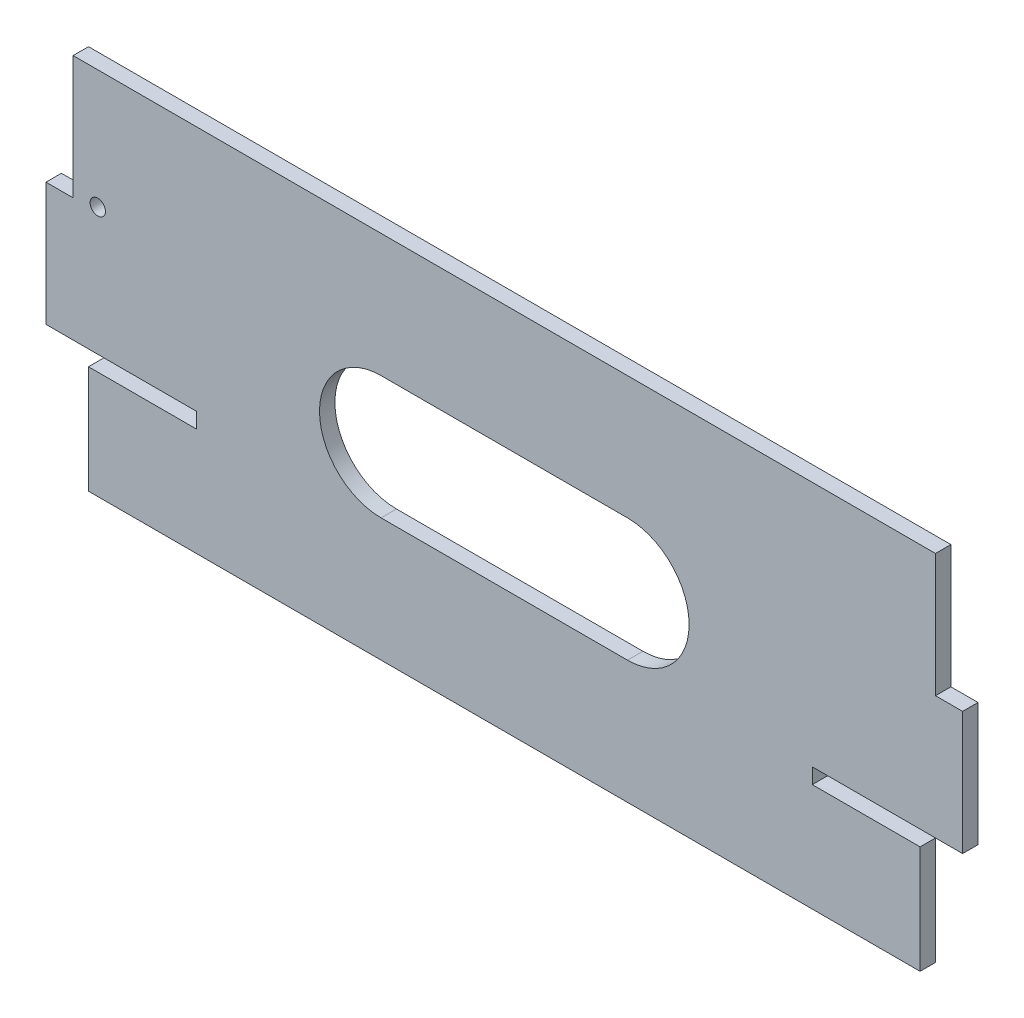
ISO-10303-21;
HEADER;
FILE_DESCRIPTION(('STEP AP214'),'2;1');
FILE_NAME('part.step','',(''),(''),'','','');
FILE_SCHEMA(('AUTOMOTIVE_DESIGN { 1 0 10303 214 1 1 1 1 }'));
ENDSEC;
DATA;
#1=APPLICATION_CONTEXT('core data for automotive mechanical design processes');
#2=APPLICATION_PROTOCOL_DEFINITION('international standard','automotive_design',2000,#1);
#3=PRODUCT_CONTEXT('',#1,'mechanical');
#4=PRODUCT('Part','Part','',(#3));
#5=PRODUCT_RELATED_PRODUCT_CATEGORY('part','',(#4));
#6=PRODUCT_DEFINITION_FORMATION('','',#4);
#7=PRODUCT_DEFINITION_CONTEXT('part definition',#1,'design');
#8=PRODUCT_DEFINITION('design','',#6,#7);
#9=PRODUCT_DEFINITION_SHAPE('','',#8);
#10=(LENGTH_UNIT() NAMED_UNIT(*) SI_UNIT(.MILLI.,.METRE.));
#11=(NAMED_UNIT(*) PLANE_ANGLE_UNIT() SI_UNIT($,.RADIAN.));
#12=(NAMED_UNIT(*) SI_UNIT($,.STERADIAN.) SOLID_ANGLE_UNIT());
#13=UNCERTAINTY_MEASURE_WITH_UNIT(LENGTH_MEASURE(1.E-05),#10,'distance_accuracy_value','');
#14=(GEOMETRIC_REPRESENTATION_CONTEXT(3) GLOBAL_UNCERTAINTY_ASSIGNED_CONTEXT((#13)) GLOBAL_UNIT_ASSIGNED_CONTEXT((#10,
#11,#12)) REPRESENTATION_CONTEXT('',''));
#15=CARTESIAN_POINT('',(0.,0.,0.));
#16=DIRECTION('',(0.,0.,1.));
#17=DIRECTION('',(1.,0.,0.));
#18=AXIS2_PLACEMENT_3D('',#15,#16,#17);
#19=CARTESIAN_POINT('',(0.,0.,-447.675));
#20=DIRECTION('',(0.,0.,1.));
#21=DIRECTION('',(1.,0.,0.));
#22=AXIS2_PLACEMENT_3D('',#19,#20,#21);
#23=PLANE('',#22);
#24=DIRECTION('',(-1.,0.,0.));
#25=VECTOR('',#24,1.);
#26=CARTESIAN_POINT('',(88.9,-60.325,-447.675));
#27=LINE('',#26,#25);
#28=CARTESIAN_POINT('',(88.9,-60.325,-447.675));
#29=VERTEX_POINT('',#28);
#30=CARTESIAN_POINT('',(-88.9,-60.3250000000001,-447.675));
#31=VERTEX_POINT('',#30);
#32=EDGE_CURVE('E211',#29,#31,#27,.T.);
#33=ORIENTED_EDGE('',*,*,#32,.T.);
#34=DIRECTION('',(0.,-1.,0.));
#35=VECTOR('',#34,1.);
#36=CARTESIAN_POINT('',(-88.9,-60.3250000000001,-447.675));
#37=LINE('',#36,#35);
#38=CARTESIAN_POINT('',(-88.9,-85.7250000000001,-447.675));
#39=VERTEX_POINT('',#38);
#40=EDGE_CURVE('E214',#31,#39,#37,.T.);
#41=ORIENTED_EDGE('',*,*,#40,.T.);
#42=DIRECTION('',(-1.,0.,0.));
#43=VECTOR('',#42,1.);
#44=CARTESIAN_POINT('',(-88.9,-85.7250000000001,-447.675));
#45=LINE('',#44,#43);
#46=CARTESIAN_POINT('',(-94.488,-85.7250000000001,-447.675));
#47=VERTEX_POINT('',#46);
#48=EDGE_CURVE('E217',#39,#47,#45,.T.);
#49=ORIENTED_EDGE('',*,*,#48,.T.);
#50=DIRECTION('',(0.,-1.,0.));
#51=VECTOR('',#50,1.);
#52=CARTESIAN_POINT('',(-94.488,-85.7250000000001,-447.675));
#53=LINE('',#52,#51);
#54=CARTESIAN_POINT('',(-94.488,-111.125,-447.675));
#55=VERTEX_POINT('',#54);
#56=EDGE_CURVE('E219',#47,#55,#53,.T.);
#57=ORIENTED_EDGE('',*,*,#56,.T.);
#58=DIRECTION('',(1.,0.,0.));
#59=VECTOR('',#58,1.);
#60=CARTESIAN_POINT('',(-94.488,-111.125,-447.675));
#61=LINE('',#60,#59);
#62=CARTESIAN_POINT('',(-63.5,-111.125,-447.675));
#63=VERTEX_POINT('',#62);
#64=EDGE_CURVE('E221',#55,#63,#61,.T.);
#65=ORIENTED_EDGE('',*,*,#64,.T.);
#66=DIRECTION('',(0.,-1.,0.));
#67=VECTOR('',#66,1.);
#68=CARTESIAN_POINT('',(-63.5,-111.125,-447.675));
#69=LINE('',#68,#67);
#70=CARTESIAN_POINT('',(-63.5,-114.3,-447.675));
#71=VERTEX_POINT('',#70);
#72=EDGE_CURVE('E223',#63,#71,#69,.T.);
#73=ORIENTED_EDGE('',*,*,#72,.T.);
#74=DIRECTION('',(-1.,0.,0.));
#75=VECTOR('',#74,1.);
#76=CARTESIAN_POINT('',(-63.5,-114.3,-447.675));
#77=LINE('',#76,#75);
#78=CARTESIAN_POINT('',(-85.725,-114.3,-447.675));
#79=VERTEX_POINT('',#78);
#80=EDGE_CURVE('E225',#71,#79,#77,.T.);
#81=ORIENTED_EDGE('',*,*,#80,.T.);
#82=DIRECTION('',(0.,-1.,0.));
#83=VECTOR('',#82,1.);
#84=CARTESIAN_POINT('',(-85.725,-114.3,-447.675));
#85=LINE('',#84,#83);
#86=CARTESIAN_POINT('',(-85.725,-136.525,-447.675));
#87=VERTEX_POINT('',#86);
#88=EDGE_CURVE('E227',#79,#87,#85,.T.);
#89=ORIENTED_EDGE('',*,*,#88,.T.);
#90=DIRECTION('',(1.,0.,0.));
#91=VECTOR('',#90,1.);
#92=CARTESIAN_POINT('',(-85.725,-136.525,-447.675));
#93=LINE('',#92,#91);
#94=CARTESIAN_POINT('',(85.725,-136.525,-447.675));
#95=VERTEX_POINT('',#94);
#96=EDGE_CURVE('E229',#87,#95,#93,.T.);
#97=ORIENTED_EDGE('',*,*,#96,.T.);
#98=DIRECTION('',(0.,1.,0.));
#99=VECTOR('',#98,1.);
#100=CARTESIAN_POINT('',(85.725,-114.3,-447.675));
#101=LINE('',#100,#99);
#102=CARTESIAN_POINT('',(85.725,-114.3,-447.675));
#103=VERTEX_POINT('',#102);
#104=EDGE_CURVE('E231',#95,#103,#101,.T.);
#105=ORIENTED_EDGE('',*,*,#104,.T.);
#106=DIRECTION('',(-1.,0.,0.));
#107=VECTOR('',#106,1.);
#108=CARTESIAN_POINT('',(63.5,-114.3,-447.675));
#109=LINE('',#108,#107);
#110=CARTESIAN_POINT('',(63.5,-114.3,-447.675));
#111=VERTEX_POINT('',#110);
#112=EDGE_CURVE('E233',#103,#111,#109,.T.);
#113=ORIENTED_EDGE('',*,*,#112,.T.);
#114=DIRECTION('',(0.,1.,0.));
#115=VECTOR('',#114,1.);
#116=CARTESIAN_POINT('',(63.5,-111.125,-447.675));
#117=LINE('',#116,#115);
#118=CARTESIAN_POINT('',(63.5,-111.125,-447.675));
#119=VERTEX_POINT('',#118);
#120=EDGE_CURVE('E235',#111,#119,#117,.T.);
#121=ORIENTED_EDGE('',*,*,#120,.T.);
#122=DIRECTION('',(1.,0.,0.));
#123=VECTOR('',#122,1.);
#124=CARTESIAN_POINT('',(88.9,-111.125,-447.675));
#125=LINE('',#124,#123);
#126=CARTESIAN_POINT('',(94.488,-111.125,-447.675));
#127=VERTEX_POINT('',#126);
#128=EDGE_CURVE('E237',#119,#127,#125,.T.);
#129=ORIENTED_EDGE('',*,*,#128,.T.);
#130=DIRECTION('',(0.,1.,0.));
#131=VECTOR('',#130,1.);
#132=CARTESIAN_POINT('',(94.488,-85.725,-447.675));
#133=LINE('',#132,#131);
#134=CARTESIAN_POINT('',(94.488,-85.725,-447.675));
#135=VERTEX_POINT('',#134);
#136=EDGE_CURVE('E239',#127,#135,#133,.T.);
#137=ORIENTED_EDGE('',*,*,#136,.T.);
#138=DIRECTION('',(-1.,0.,0.));
#139=VECTOR('',#138,1.);
#140=CARTESIAN_POINT('',(88.9,-85.725,-447.675));
#141=LINE('',#140,#139);
#142=CARTESIAN_POINT('',(88.9,-85.725,-447.675));
#143=VERTEX_POINT('',#142);
#144=EDGE_CURVE('E241',#135,#143,#141,.T.);
#145=ORIENTED_EDGE('',*,*,#144,.T.);
#146=DIRECTION('',(0.,1.,0.));
#147=VECTOR('',#146,1.);
#148=CARTESIAN_POINT('',(88.9,-60.325,-447.675));
#149=LINE('',#148,#147);
#150=EDGE_CURVE('E243',#143,#29,#149,.T.);
#151=ORIENTED_EDGE('',*,*,#150,.T.);
#152=EDGE_LOOP('',(#33,#41,#49,#57,#65,#73,#81,#89,#97,#105,#113,#121,#129,#137,#145,#151));
#153=FACE_BOUND('',#152,.T.);
#154=CARTESIAN_POINT('',(-83.82,-84.8367141014244,-447.675));
#155=DIRECTION('',(0.,0.,1.));
#156=DIRECTION('',(1.,0.,0.));
#157=AXIS2_PLACEMENT_3D('',#154,#155,#156);
#158=CIRCLE('',#157,1.58749999999999);
#159=CARTESIAN_POINT('',(-82.2325,-84.8367141014244,-447.675));
#160=VERTEX_POINT('',#159);
#161=EDGE_CURVE('E205',#160,#160,#158,.T.);
#162=ORIENTED_EDGE('',*,*,#161,.F.);
#163=EDGE_LOOP('',(#162));
#164=FACE_BOUND('',#163,.T.);
#165=DIRECTION('',(1.,0.,0.));
#166=VECTOR('',#165,1.);
#167=CARTESIAN_POINT('',(-25.4,-111.125,-447.675));
#168=LINE('',#167,#166);
#169=CARTESIAN_POINT('',(-25.4,-111.125,-447.675));
#170=VERTEX_POINT('',#169);
#171=CARTESIAN_POINT('',(25.4,-111.125,-447.675));
#172=VERTEX_POINT('',#171);
#173=EDGE_CURVE('E177',#170,#172,#168,.T.);
#174=ORIENTED_EDGE('',*,*,#173,.F.);
#175=CARTESIAN_POINT('',(-25.4,-98.4250000000001,-447.675));
#176=DIRECTION('',(0.,0.,1.));
#177=DIRECTION('',(1.,0.,0.));
#178=AXIS2_PLACEMENT_3D('',#175,#176,#177);
#179=CIRCLE('',#178,12.7);
#180=CARTESIAN_POINT('',(-25.4,-85.7250000000001,-447.675));
#181=VERTEX_POINT('',#180);
#182=EDGE_CURVE('E169',#181,#170,#179,.T.);
#183=ORIENTED_EDGE('',*,*,#182,.F.);
#184=DIRECTION('',(-1.,0.,0.));
#185=VECTOR('',#184,1.);
#186=CARTESIAN_POINT('',(-25.4,-85.7250000000001,-447.675));
#187=LINE('',#186,#185);
#188=CARTESIAN_POINT('',(25.4,-85.7250000000001,-447.675));
#189=VERTEX_POINT('',#188);
#190=EDGE_CURVE('E191',#189,#181,#187,.T.);
#191=ORIENTED_EDGE('',*,*,#190,.F.);
#192=CARTESIAN_POINT('',(25.4,-98.4250000000001,-447.675));
#193=DIRECTION('',(0.,0.,1.));
#194=DIRECTION('',(1.,0.,0.));
#195=AXIS2_PLACEMENT_3D('',#192,#193,#194);
#196=CIRCLE('',#195,12.7);
#197=EDGE_CURVE('E189',#172,#189,#196,.T.);
#198=ORIENTED_EDGE('',*,*,#197,.F.);
#199=EDGE_LOOP('',(#174,#183,#191,#198));
#200=FACE_BOUND('',#199,.T.);
#201=ADVANCED_FACE('F32',(#153,#164,#200),#23,.T.);
#202=CARTESIAN_POINT('',(0.,0.,-450.85));
#203=DIRECTION('',(0.,0.,1.));
#204=DIRECTION('',(1.,0.,0.));
#205=AXIS2_PLACEMENT_3D('',#202,#203,#204);
#206=PLANE('',#205);
#207=CARTESIAN_POINT('',(-83.82,-84.8367141014244,-450.85));
#208=DIRECTION('',(0.,0.,1.));
#209=DIRECTION('',(1.,0.,0.));
#210=AXIS2_PLACEMENT_3D('',#207,#208,#209);
#211=CIRCLE('',#210,1.58749999999999);
#212=CARTESIAN_POINT('',(-82.2325,-84.8367141014244,-450.85));
#213=VERTEX_POINT('',#212);
#214=EDGE_CURVE('E185',#213,#213,#211,.T.);
#215=ORIENTED_EDGE('',*,*,#214,.T.);
#216=EDGE_LOOP('',(#215));
#217=FACE_BOUND('',#216,.T.);
#218=DIRECTION('',(-1.,0.,0.));
#219=VECTOR('',#218,1.);
#220=CARTESIAN_POINT('',(88.9,-60.325,-450.85));
#221=LINE('',#220,#219);
#222=CARTESIAN_POINT('',(88.9,-60.325,-450.85));
#223=VERTEX_POINT('',#222);
#224=CARTESIAN_POINT('',(-88.9,-60.3250000000001,-450.85));
#225=VERTEX_POINT('',#224);
#226=EDGE_CURVE('E208',#223,#225,#221,.T.);
#227=ORIENTED_EDGE('',*,*,#226,.F.);
#228=DIRECTION('',(0.,1.,0.));
#229=VECTOR('',#228,1.);
#230=CARTESIAN_POINT('',(88.9,-60.325,-450.85));
#231=LINE('',#230,#229);
#232=CARTESIAN_POINT('',(88.9,-85.725,-450.85));
#233=VERTEX_POINT('',#232);
#234=EDGE_CURVE('E215',#233,#223,#231,.T.);
#235=ORIENTED_EDGE('',*,*,#234,.F.);
#236=DIRECTION('',(-1.,0.,0.));
#237=VECTOR('',#236,1.);
#238=CARTESIAN_POINT('',(88.9,-85.725,-450.85));
#239=LINE('',#238,#237);
#240=CARTESIAN_POINT('',(94.488,-85.725,-450.85));
#241=VERTEX_POINT('',#240);
#242=EDGE_CURVE('E276',#241,#233,#239,.T.);
#243=ORIENTED_EDGE('',*,*,#242,.F.);
#244=DIRECTION('',(0.,1.,0.));
#245=VECTOR('',#244,1.);
#246=CARTESIAN_POINT('',(94.488,-85.725,-450.85));
#247=LINE('',#246,#245);
#248=CARTESIAN_POINT('',(94.488,-111.125,-450.85));
#249=VERTEX_POINT('',#248);
#250=EDGE_CURVE('E274',#249,#241,#247,.T.);
#251=ORIENTED_EDGE('',*,*,#250,.F.);
#252=DIRECTION('',(1.,0.,0.));
#253=VECTOR('',#252,1.);
#254=CARTESIAN_POINT('',(94.488,-111.125,-450.85));
#255=LINE('',#254,#253);
#256=CARTESIAN_POINT('',(63.5,-111.125,-450.85));
#257=VERTEX_POINT('',#256);
#258=EDGE_CURVE('E272',#257,#249,#255,.T.);
#259=ORIENTED_EDGE('',*,*,#258,.F.);
#260=DIRECTION('',(0.,1.,0.));
#261=VECTOR('',#260,1.);
#262=CARTESIAN_POINT('',(63.5,-111.125,-450.85));
#263=LINE('',#262,#261);
#264=CARTESIAN_POINT('',(63.5,-114.3,-450.85));
#265=VERTEX_POINT('',#264);
#266=EDGE_CURVE('E269',#265,#257,#263,.T.);
#267=ORIENTED_EDGE('',*,*,#266,.F.);
#268=DIRECTION('',(-1.,0.,0.));
#269=VECTOR('',#268,1.);
#270=CARTESIAN_POINT('',(63.5,-114.3,-450.85));
#271=LINE('',#270,#269);
#272=CARTESIAN_POINT('',(85.725,-114.3,-450.85));
#273=VERTEX_POINT('',#272);
#274=EDGE_CURVE('E267',#273,#265,#271,.T.);
#275=ORIENTED_EDGE('',*,*,#274,.F.);
#276=DIRECTION('',(0.,1.,0.));
#277=VECTOR('',#276,1.);
#278=CARTESIAN_POINT('',(85.725,-114.3,-450.85));
#279=LINE('',#278,#277);
#280=CARTESIAN_POINT('',(85.725,-136.525,-450.85));
#281=VERTEX_POINT('',#280);
#282=EDGE_CURVE('E265',#281,#273,#279,.T.);
#283=ORIENTED_EDGE('',*,*,#282,.F.);
#284=DIRECTION('',(1.,0.,0.));
#285=VECTOR('',#284,1.);
#286=CARTESIAN_POINT('',(-85.725,-136.525,-450.85));
#287=LINE('',#286,#285);
#288=CARTESIAN_POINT('',(-85.725,-136.525,-450.85));
#289=VERTEX_POINT('',#288);
#290=EDGE_CURVE('E263',#289,#281,#287,.T.);
#291=ORIENTED_EDGE('',*,*,#290,.F.);
#292=DIRECTION('',(0.,-1.,0.));
#293=VECTOR('',#292,1.);
#294=CARTESIAN_POINT('',(-85.725,-114.3,-450.85));
#295=LINE('',#294,#293);
#296=CARTESIAN_POINT('',(-85.725,-114.3,-450.85));
#297=VERTEX_POINT('',#296);
#298=EDGE_CURVE('E261',#297,#289,#295,.T.);
#299=ORIENTED_EDGE('',*,*,#298,.F.);
#300=DIRECTION('',(-1.,0.,0.));
#301=VECTOR('',#300,1.);
#302=CARTESIAN_POINT('',(-63.5,-114.3,-450.85));
#303=LINE('',#302,#301);
#304=CARTESIAN_POINT('',(-63.5,-114.3,-450.85));
#305=VERTEX_POINT('',#304);
#306=EDGE_CURVE('E259',#305,#297,#303,.T.);
#307=ORIENTED_EDGE('',*,*,#306,.F.);
#308=DIRECTION('',(0.,-1.,0.));
#309=VECTOR('',#308,1.);
#310=CARTESIAN_POINT('',(-63.5,-111.125,-450.85));
#311=LINE('',#310,#309);
#312=CARTESIAN_POINT('',(-63.5,-111.125,-450.85));
#313=VERTEX_POINT('',#312);
#314=EDGE_CURVE('E257',#313,#305,#311,.T.);
#315=ORIENTED_EDGE('',*,*,#314,.F.);
#316=DIRECTION('',(1.,0.,0.));
#317=VECTOR('',#316,1.);
#318=CARTESIAN_POINT('',(-88.9,-111.125,-450.85));
#319=LINE('',#318,#317);
#320=CARTESIAN_POINT('',(-94.488,-111.125,-450.85));
#321=VERTEX_POINT('',#320);
#322=EDGE_CURVE('E255',#321,#313,#319,.T.);
#323=ORIENTED_EDGE('',*,*,#322,.F.);
#324=DIRECTION('',(0.,-1.,0.));
#325=VECTOR('',#324,1.);
#326=CARTESIAN_POINT('',(-94.488,-85.7250000000001,-450.85));
#327=LINE('',#326,#325);
#328=CARTESIAN_POINT('',(-94.488,-85.7250000000001,-450.85));
#329=VERTEX_POINT('',#328);
#330=EDGE_CURVE('E252',#329,#321,#327,.T.);
#331=ORIENTED_EDGE('',*,*,#330,.F.);
#332=DIRECTION('',(-1.,0.,0.));
#333=VECTOR('',#332,1.);
#334=CARTESIAN_POINT('',(-88.9,-85.7250000000001,-450.85));
#335=LINE('',#334,#333);
#336=CARTESIAN_POINT('',(-88.9,-85.7250000000001,-450.85));
#337=VERTEX_POINT('',#336);
#338=EDGE_CURVE('E250',#337,#329,#335,.T.);
#339=ORIENTED_EDGE('',*,*,#338,.F.);
#340=DIRECTION('',(0.,-1.,0.));
#341=VECTOR('',#340,1.);
#342=CARTESIAN_POINT('',(-88.9,-60.3250000000001,-450.85));
#343=LINE('',#342,#341);
#344=EDGE_CURVE('E248',#225,#337,#343,.T.);
#345=ORIENTED_EDGE('',*,*,#344,.F.);
#346=EDGE_LOOP('',(#227,#235,#243,#251,#259,#267,#275,#283,#291,#299,#307,#315,#323,#331,#339,#345));
#347=FACE_BOUND('',#346,.T.);
#348=CARTESIAN_POINT('',(-25.4,-98.4250000000001,-450.85));
#349=DIRECTION('',(0.,0.,1.));
#350=DIRECTION('',(1.,0.,0.));
#351=AXIS2_PLACEMENT_3D('',#348,#349,#350);
#352=CIRCLE('',#351,12.7);
#353=CARTESIAN_POINT('',(-25.4,-85.7250000000001,-450.85));
#354=VERTEX_POINT('',#353);
#355=CARTESIAN_POINT('',(-25.4,-111.125,-450.85));
#356=VERTEX_POINT('',#355);
#357=EDGE_CURVE('E55',#354,#356,#352,.T.);
#358=ORIENTED_EDGE('',*,*,#357,.T.);
#359=DIRECTION('',(1.,0.,0.));
#360=VECTOR('',#359,1.);
#361=CARTESIAN_POINT('',(-25.4,-111.125,-450.85));
#362=LINE('',#361,#360);
#363=CARTESIAN_POINT('',(25.4,-111.125,-450.85));
#364=VERTEX_POINT('',#363);
#365=EDGE_CURVE('E184',#356,#364,#362,.T.);
#366=ORIENTED_EDGE('',*,*,#365,.T.);
#367=CARTESIAN_POINT('',(25.4,-98.4250000000001,-450.85));
#368=DIRECTION('',(0.,0.,1.));
#369=DIRECTION('',(1.,0.,0.));
#370=AXIS2_PLACEMENT_3D('',#367,#368,#369);
#371=CIRCLE('',#370,12.7);
#372=CARTESIAN_POINT('',(25.4,-85.7250000000001,-450.85));
#373=VERTEX_POINT('',#372);
#374=EDGE_CURVE('E197',#364,#373,#371,.T.);
#375=ORIENTED_EDGE('',*,*,#374,.T.);
#376=DIRECTION('',(-1.,0.,0.));
#377=VECTOR('',#376,1.);
#378=CARTESIAN_POINT('',(-25.4,-85.7250000000001,-450.85));
#379=LINE('',#378,#377);
#380=EDGE_CURVE('E178',#373,#354,#379,.T.);
#381=ORIENTED_EDGE('',*,*,#380,.T.);
#382=EDGE_LOOP('',(#358,#366,#375,#381));
#383=FACE_BOUND('',#382,.T.);
#384=ADVANCED_FACE('F330',(#217,#347,#383),#206,.F.);
#385=CARTESIAN_POINT('',(88.9,-60.325,-447.675));
#386=DIRECTION('',(0.,-1.,0.));
#387=DIRECTION('',(1.,0.,0.));
#388=AXIS2_PLACEMENT_3D('',#385,#386,#387);
#389=PLANE('',#388);
#390=ORIENTED_EDGE('',*,*,#226,.T.);
#391=DIRECTION('',(0.,0.,-1.));
#392=VECTOR('',#391,1.);
#393=CARTESIAN_POINT('',(-88.9,-60.3250000000001,-447.675));
#394=LINE('',#393,#392);
#395=EDGE_CURVE('E11',#31,#225,#394,.T.);
#396=ORIENTED_EDGE('',*,*,#395,.F.);
#397=ORIENTED_EDGE('',*,*,#32,.F.);
#398=DIRECTION('',(0.,0.,-1.));
#399=VECTOR('',#398,1.);
#400=CARTESIAN_POINT('',(88.9,-60.325,-447.675));
#401=LINE('',#400,#399);
#402=EDGE_CURVE('E245',#29,#223,#401,.T.);
#403=ORIENTED_EDGE('',*,*,#402,.T.);
#404=EDGE_LOOP('',(#390,#396,#397,#403));
#405=FACE_BOUND('',#404,.T.);
#406=ADVANCED_FACE('F34',(#405),#389,.F.);
#407=CARTESIAN_POINT('',(-88.9,-60.3250000000001,-447.675));
#408=DIRECTION('',(1.,0.,0.));
#409=DIRECTION('',(0.,0.,-1.));
#410=AXIS2_PLACEMENT_3D('',#407,#408,#409);
#411=PLANE('',#410);
#412=ORIENTED_EDGE('',*,*,#344,.T.);
#413=DIRECTION('',(0.,0.,-1.));
#414=VECTOR('',#413,1.);
#415=CARTESIAN_POINT('',(-88.9,-85.7250000000001,-447.675));
#416=LINE('',#415,#414);
#417=EDGE_CURVE('E40',#39,#337,#416,.T.);
#418=ORIENTED_EDGE('',*,*,#417,.F.);
#419=ORIENTED_EDGE('',*,*,#40,.F.);
#420=ORIENTED_EDGE('',*,*,#395,.T.);
#421=EDGE_LOOP('',(#412,#418,#419,#420));
#422=FACE_BOUND('',#421,.T.);
#423=ADVANCED_FACE('F347',(#422),#411,.F.);
#424=CARTESIAN_POINT('',(-88.9,-85.7250000000001,-447.675));
#425=DIRECTION('',(0.,-1.,0.));
#426=DIRECTION('',(0.,0.,-1.));
#427=AXIS2_PLACEMENT_3D('',#424,#425,#426);
#428=PLANE('',#427);
#429=ORIENTED_EDGE('',*,*,#338,.T.);
#430=DIRECTION('',(0.,0.,-1.));
#431=VECTOR('',#430,1.);
#432=CARTESIAN_POINT('',(-94.488,-85.7250000000001,-447.675));
#433=LINE('',#432,#431);
#434=EDGE_CURVE('E317',#47,#329,#433,.T.);
#435=ORIENTED_EDGE('',*,*,#434,.F.);
#436=ORIENTED_EDGE('',*,*,#48,.F.);
#437=ORIENTED_EDGE('',*,*,#417,.T.);
#438=EDGE_LOOP('',(#429,#435,#436,#437));
#439=FACE_BOUND('',#438,.T.);
#440=ADVANCED_FACE('F324',(#439),#428,.F.);
#441=CARTESIAN_POINT('',(-94.488,-85.7250000000001,-447.675));
#442=DIRECTION('',(1.,0.,0.));
#443=DIRECTION('',(0.,0.,-1.));
#444=AXIS2_PLACEMENT_3D('',#441,#442,#443);
#445=PLANE('',#444);
#446=ORIENTED_EDGE('',*,*,#330,.T.);
#447=DIRECTION('',(0.,0.,-1.));
#448=VECTOR('',#447,1.);
#449=CARTESIAN_POINT('',(-94.488,-111.125,-447.675));
#450=LINE('',#449,#448);
#451=EDGE_CURVE('E314',#55,#321,#450,.T.);
#452=ORIENTED_EDGE('',*,*,#451,.F.);
#453=ORIENTED_EDGE('',*,*,#56,.F.);
#454=ORIENTED_EDGE('',*,*,#434,.T.);
#455=EDGE_LOOP('',(#446,#452,#453,#454));
#456=FACE_BOUND('',#455,.T.);
#457=ADVANCED_FACE('F335',(#456),#445,.F.);
#458=CARTESIAN_POINT('',(-88.9,-111.125,-447.675));
#459=DIRECTION('',(0.,1.,0.));
#460=DIRECTION('',(-1.,0.,0.));
#461=AXIS2_PLACEMENT_3D('',#458,#459,#460);
#462=PLANE('',#461);
#463=ORIENTED_EDGE('',*,*,#322,.T.);
#464=DIRECTION('',(0.,0.,-1.));
#465=VECTOR('',#464,1.);
#466=CARTESIAN_POINT('',(-63.5,-111.125,-447.675));
#467=LINE('',#466,#465);
#468=EDGE_CURVE('E311',#63,#313,#467,.T.);
#469=ORIENTED_EDGE('',*,*,#468,.F.);
#470=ORIENTED_EDGE('',*,*,#64,.F.);
#471=ORIENTED_EDGE('',*,*,#451,.T.);
#472=EDGE_LOOP('',(#463,#469,#470,#471));
#473=FACE_BOUND('',#472,.T.);
#474=ADVANCED_FACE('F339',(#473),#462,.F.);
#475=CARTESIAN_POINT('',(-63.5,-111.125,-447.675));
#476=DIRECTION('',(1.,0.,0.));
#477=DIRECTION('',(0.,1.,0.));
#478=AXIS2_PLACEMENT_3D('',#475,#476,#477);
#479=PLANE('',#478);
#480=ORIENTED_EDGE('',*,*,#314,.T.);
#481=DIRECTION('',(0.,0.,-1.));
#482=VECTOR('',#481,1.);
#483=CARTESIAN_POINT('',(-63.5,-114.3,-447.675));
#484=LINE('',#483,#482);
#485=EDGE_CURVE('E308',#71,#305,#484,.T.);
#486=ORIENTED_EDGE('',*,*,#485,.F.);
#487=ORIENTED_EDGE('',*,*,#72,.F.);
#488=ORIENTED_EDGE('',*,*,#468,.T.);
#489=EDGE_LOOP('',(#480,#486,#487,#488));
#490=FACE_BOUND('',#489,.T.);
#491=ADVANCED_FACE('F399',(#490),#479,.F.);
#492=CARTESIAN_POINT('',(-63.5,-114.3,-447.675));
#493=DIRECTION('',(0.,-1.,0.));
#494=DIRECTION('',(1.,0.,0.));
#495=AXIS2_PLACEMENT_3D('',#492,#493,#494);
#496=PLANE('',#495);
#497=ORIENTED_EDGE('',*,*,#306,.T.);
#498=DIRECTION('',(0.,0.,-1.));
#499=VECTOR('',#498,1.);
#500=CARTESIAN_POINT('',(-85.725,-114.3,-447.675));
#501=LINE('',#500,#499);
#502=EDGE_CURVE('E305',#79,#297,#501,.T.);
#503=ORIENTED_EDGE('',*,*,#502,.F.);
#504=ORIENTED_EDGE('',*,*,#80,.F.);
#505=ORIENTED_EDGE('',*,*,#485,.T.);
#506=EDGE_LOOP('',(#497,#503,#504,#505));
#507=FACE_BOUND('',#506,.T.);
#508=ADVANCED_FACE('F396',(#507),#496,.F.);
#509=CARTESIAN_POINT('',(-85.725,-114.3,-447.675));
#510=DIRECTION('',(1.,0.,0.));
#511=DIRECTION('',(0.,0.,-1.));
#512=AXIS2_PLACEMENT_3D('',#509,#510,#511);
#513=PLANE('',#512);
#514=ORIENTED_EDGE('',*,*,#298,.T.);
#515=DIRECTION('',(0.,0.,-1.));
#516=VECTOR('',#515,1.);
#517=CARTESIAN_POINT('',(-85.725,-136.525,-447.675));
#518=LINE('',#517,#516);
#519=EDGE_CURVE('E302',#87,#289,#518,.T.);
#520=ORIENTED_EDGE('',*,*,#519,.F.);
#521=ORIENTED_EDGE('',*,*,#88,.F.);
#522=ORIENTED_EDGE('',*,*,#502,.T.);
#523=EDGE_LOOP('',(#514,#520,#521,#522));
#524=FACE_BOUND('',#523,.T.);
#525=ADVANCED_FACE('F392',(#524),#513,.F.);
#526=CARTESIAN_POINT('',(-85.725,-136.525,-447.675));
#527=DIRECTION('',(0.,1.,0.));
#528=DIRECTION('',(-1.,0.,0.));
#529=AXIS2_PLACEMENT_3D('',#526,#527,#528);
#530=PLANE('',#529);
#531=ORIENTED_EDGE('',*,*,#290,.T.);
#532=DIRECTION('',(0.,0.,-1.));
#533=VECTOR('',#532,1.);
#534=CARTESIAN_POINT('',(85.725,-136.525,-447.675));
#535=LINE('',#534,#533);
#536=EDGE_CURVE('E299',#95,#281,#535,.T.);
#537=ORIENTED_EDGE('',*,*,#536,.F.);
#538=ORIENTED_EDGE('',*,*,#96,.F.);
#539=ORIENTED_EDGE('',*,*,#519,.T.);
#540=EDGE_LOOP('',(#531,#537,#538,#539));
#541=FACE_BOUND('',#540,.T.);
#542=ADVANCED_FACE('F388',(#541),#530,.F.);
#543=CARTESIAN_POINT('',(85.725,-114.3,-447.675));
#544=DIRECTION('',(-1.,0.,0.));
#545=DIRECTION('',(0.,0.,1.));
#546=AXIS2_PLACEMENT_3D('',#543,#544,#545);
#547=PLANE('',#546);
#548=ORIENTED_EDGE('',*,*,#282,.T.);
#549=DIRECTION('',(0.,0.,-1.));
#550=VECTOR('',#549,1.);
#551=CARTESIAN_POINT('',(85.725,-114.3,-447.675));
#552=LINE('',#551,#550);
#553=EDGE_CURVE('E296',#103,#273,#552,.T.);
#554=ORIENTED_EDGE('',*,*,#553,.F.);
#555=ORIENTED_EDGE('',*,*,#104,.F.);
#556=ORIENTED_EDGE('',*,*,#536,.T.);
#557=EDGE_LOOP('',(#548,#554,#555,#556));
#558=FACE_BOUND('',#557,.T.);
#559=ADVANCED_FACE('F384',(#558),#547,.F.);
#560=CARTESIAN_POINT('',(63.5,-114.3,-447.675));
#561=DIRECTION('',(0.,-1.,0.));
#562=DIRECTION('',(1.,0.,0.));
#563=AXIS2_PLACEMENT_3D('',#560,#561,#562);
#564=PLANE('',#563);
#565=ORIENTED_EDGE('',*,*,#274,.T.);
#566=DIRECTION('',(0.,0.,-1.));
#567=VECTOR('',#566,1.);
#568=CARTESIAN_POINT('',(63.5,-114.3,-447.675));
#569=LINE('',#568,#567);
#570=EDGE_CURVE('E293',#111,#265,#569,.T.);
#571=ORIENTED_EDGE('',*,*,#570,.F.);
#572=ORIENTED_EDGE('',*,*,#112,.F.);
#573=ORIENTED_EDGE('',*,*,#553,.T.);
#574=EDGE_LOOP('',(#565,#571,#572,#573));
#575=FACE_BOUND('',#574,.T.);
#576=ADVANCED_FACE('F379',(#575),#564,.F.);
#577=CARTESIAN_POINT('',(63.5,-111.125,-447.675));
#578=DIRECTION('',(-1.,0.,0.));
#579=DIRECTION('',(0.,-1.,0.));
#580=AXIS2_PLACEMENT_3D('',#577,#578,#579);
#581=PLANE('',#580);
#582=ORIENTED_EDGE('',*,*,#266,.T.);
#583=DIRECTION('',(0.,0.,-1.));
#584=VECTOR('',#583,1.);
#585=CARTESIAN_POINT('',(63.5,-111.125,-447.675));
#586=LINE('',#585,#584);
#587=EDGE_CURVE('E290',#119,#257,#586,.T.);
#588=ORIENTED_EDGE('',*,*,#587,.F.);
#589=ORIENTED_EDGE('',*,*,#120,.F.);
#590=ORIENTED_EDGE('',*,*,#570,.T.);
#591=EDGE_LOOP('',(#582,#588,#589,#590));
#592=FACE_BOUND('',#591,.T.);
#593=ADVANCED_FACE('F370',(#592),#581,.F.);
#594=CARTESIAN_POINT('',(94.488,-111.125,-447.675));
#595=DIRECTION('',(0.,1.,0.));
#596=DIRECTION('',(0.,0.,1.));
#597=AXIS2_PLACEMENT_3D('',#594,#595,#596);
#598=PLANE('',#597);
#599=ORIENTED_EDGE('',*,*,#258,.T.);
#600=DIRECTION('',(0.,0.,-1.));
#601=VECTOR('',#600,1.);
#602=CARTESIAN_POINT('',(94.488,-111.125,-447.675));
#603=LINE('',#602,#601);
#604=EDGE_CURVE('E287',#127,#249,#603,.T.);
#605=ORIENTED_EDGE('',*,*,#604,.F.);
#606=ORIENTED_EDGE('',*,*,#128,.F.);
#607=ORIENTED_EDGE('',*,*,#587,.T.);
#608=EDGE_LOOP('',(#599,#605,#606,#607));
#609=FACE_BOUND('',#608,.T.);
#610=ADVANCED_FACE('F374',(#609),#598,.F.);
#611=CARTESIAN_POINT('',(94.488,-85.725,-447.675));
#612=DIRECTION('',(-1.,0.,0.));
#613=DIRECTION('',(0.,0.,1.));
#614=AXIS2_PLACEMENT_3D('',#611,#612,#613);
#615=PLANE('',#614);
#616=ORIENTED_EDGE('',*,*,#250,.T.);
#617=DIRECTION('',(0.,0.,-1.));
#618=VECTOR('',#617,1.);
#619=CARTESIAN_POINT('',(94.488,-85.725,-447.675));
#620=LINE('',#619,#618);
#621=EDGE_CURVE('E284',#135,#241,#620,.T.);
#622=ORIENTED_EDGE('',*,*,#621,.F.);
#623=ORIENTED_EDGE('',*,*,#136,.F.);
#624=ORIENTED_EDGE('',*,*,#604,.T.);
#625=EDGE_LOOP('',(#616,#622,#623,#624));
#626=FACE_BOUND('',#625,.T.);
#627=ADVANCED_FACE('F363',(#626),#615,.F.);
#628=CARTESIAN_POINT('',(88.9,-85.725,-447.675));
#629=DIRECTION('',(0.,-1.,0.));
#630=DIRECTION('',(0.,0.,-1.));
#631=AXIS2_PLACEMENT_3D('',#628,#629,#630);
#632=PLANE('',#631);
#633=ORIENTED_EDGE('',*,*,#242,.T.);
#634=DIRECTION('',(0.,0.,-1.));
#635=VECTOR('',#634,1.);
#636=CARTESIAN_POINT('',(88.9,-85.725,-447.675));
#637=LINE('',#636,#635);
#638=EDGE_CURVE('E281',#143,#233,#637,.T.);
#639=ORIENTED_EDGE('',*,*,#638,.F.);
#640=ORIENTED_EDGE('',*,*,#144,.F.);
#641=ORIENTED_EDGE('',*,*,#621,.T.);
#642=EDGE_LOOP('',(#633,#639,#640,#641));
#643=FACE_BOUND('',#642,.T.);
#644=ADVANCED_FACE('F359',(#643),#632,.F.);
#645=CARTESIAN_POINT('',(88.9,-60.325,-447.675));
#646=DIRECTION('',(-1.,0.,0.));
#647=DIRECTION('',(0.,0.,1.));
#648=AXIS2_PLACEMENT_3D('',#645,#646,#647);
#649=PLANE('',#648);
#650=ORIENTED_EDGE('',*,*,#234,.T.);
#651=ORIENTED_EDGE('',*,*,#402,.F.);
#652=ORIENTED_EDGE('',*,*,#150,.F.);
#653=ORIENTED_EDGE('',*,*,#638,.T.);
#654=EDGE_LOOP('',(#650,#651,#652,#653));
#655=FACE_BOUND('',#654,.T.);
#656=ADVANCED_FACE('F354',(#655),#649,.F.);
#657=CARTESIAN_POINT('',(-83.82,-84.8367141014244,-447.675));
#658=DIRECTION('',(0.,0.,-1.));
#659=DIRECTION('',(-1.,0.,0.));
#660=AXIS2_PLACEMENT_3D('',#657,#658,#659);
#661=CYLINDRICAL_SURFACE('',#660,1.58749999999999);
#662=ORIENTED_EDGE('',*,*,#161,.T.);
#663=EDGE_LOOP('',(#662));
#664=FACE_BOUND('',#663,.T.);
#665=ORIENTED_EDGE('',*,*,#214,.F.);
#666=EDGE_LOOP('',(#665));
#667=FACE_BOUND('',#666,.T.);
#668=ADVANCED_FACE('F416',(#664,#667),#661,.F.);
#669=CARTESIAN_POINT('',(-25.4,-98.4250000000001,-447.675));
#670=DIRECTION('',(0.,0.,-1.));
#671=DIRECTION('',(-1.,0.,0.));
#672=AXIS2_PLACEMENT_3D('',#669,#670,#671);
#673=CYLINDRICAL_SURFACE('',#672,12.7);
#674=ORIENTED_EDGE('',*,*,#357,.F.);
#675=DIRECTION('',(0.,0.,-1.));
#676=VECTOR('',#675,1.);
#677=CARTESIAN_POINT('',(-25.4,-85.7250000000001,-447.675));
#678=LINE('',#677,#676);
#679=EDGE_CURVE('E173',#181,#354,#678,.T.);
#680=ORIENTED_EDGE('',*,*,#679,.F.);
#681=ORIENTED_EDGE('',*,*,#182,.T.);
#682=DIRECTION('',(0.,0.,-1.));
#683=VECTOR('',#682,1.);
#684=CARTESIAN_POINT('',(-25.4,-111.125,-447.675));
#685=LINE('',#684,#683);
#686=EDGE_CURVE('E172',#170,#356,#685,.T.);
#687=ORIENTED_EDGE('',*,*,#686,.T.);
#688=EDGE_LOOP('',(#674,#680,#681,#687));
#689=FACE_BOUND('',#688,.T.);
#690=ADVANCED_FACE('F171',(#689),#673,.F.);
#691=CARTESIAN_POINT('',(-25.4,-111.125,-447.675));
#692=DIRECTION('',(0.,1.,0.));
#693=DIRECTION('',(0.,0.,1.));
#694=AXIS2_PLACEMENT_3D('',#691,#692,#693);
#695=PLANE('',#694);
#696=ORIENTED_EDGE('',*,*,#365,.F.);
#697=ORIENTED_EDGE('',*,*,#686,.F.);
#698=ORIENTED_EDGE('',*,*,#173,.T.);
#699=DIRECTION('',(0.,0.,-1.));
#700=VECTOR('',#699,1.);
#701=CARTESIAN_POINT('',(25.4,-111.125,-447.675));
#702=LINE('',#701,#700);
#703=EDGE_CURVE('E186',#172,#364,#702,.T.);
#704=ORIENTED_EDGE('',*,*,#703,.T.);
#705=EDGE_LOOP('',(#696,#697,#698,#704));
#706=FACE_BOUND('',#705,.T.);
#707=ADVANCED_FACE('F181',(#706),#695,.T.);
#708=CARTESIAN_POINT('',(25.4,-98.4250000000001,-447.675));
#709=DIRECTION('',(0.,0.,-1.));
#710=DIRECTION('',(-1.,0.,0.));
#711=AXIS2_PLACEMENT_3D('',#708,#709,#710);
#712=CYLINDRICAL_SURFACE('',#711,12.7);
#713=ORIENTED_EDGE('',*,*,#374,.F.);
#714=ORIENTED_EDGE('',*,*,#703,.F.);
#715=ORIENTED_EDGE('',*,*,#197,.T.);
#716=DIRECTION('',(0.,0.,-1.));
#717=VECTOR('',#716,1.);
#718=CARTESIAN_POINT('',(25.4,-85.7250000000001,-447.675));
#719=LINE('',#718,#717);
#720=EDGE_CURVE('E47',#189,#373,#719,.T.);
#721=ORIENTED_EDGE('',*,*,#720,.T.);
#722=EDGE_LOOP('',(#713,#714,#715,#721));
#723=FACE_BOUND('',#722,.T.);
#724=ADVANCED_FACE('F500',(#723),#712,.F.);
#725=CARTESIAN_POINT('',(-25.4,-85.7250000000001,-447.675));
#726=DIRECTION('',(0.,-1.,0.));
#727=DIRECTION('',(0.,0.,-1.));
#728=AXIS2_PLACEMENT_3D('',#725,#726,#727);
#729=PLANE('',#728);
#730=ORIENTED_EDGE('',*,*,#380,.F.);
#731=ORIENTED_EDGE('',*,*,#720,.F.);
#732=ORIENTED_EDGE('',*,*,#190,.T.);
#733=ORIENTED_EDGE('',*,*,#679,.T.);
#734=EDGE_LOOP('',(#730,#731,#732,#733));
#735=FACE_BOUND('',#734,.T.);
#736=ADVANCED_FACE('F508',(#735),#729,.T.);
#737=CLOSED_SHELL('',(#201,#384,#406,#423,#440,#457,#474,#491,#508,#525,#542,#559,#576,#593,
#610,#627,#644,#656,#668,#690,#707,#724,#736));
#738=MANIFOLD_SOLID_BREP('B2',#737);
#739=ADVANCED_BREP_SHAPE_REPRESENTATION('',(#18,#738),#14);
#740=SHAPE_DEFINITION_REPRESENTATION(#9,#739);
ENDSEC;
END-ISO-10303-21;
